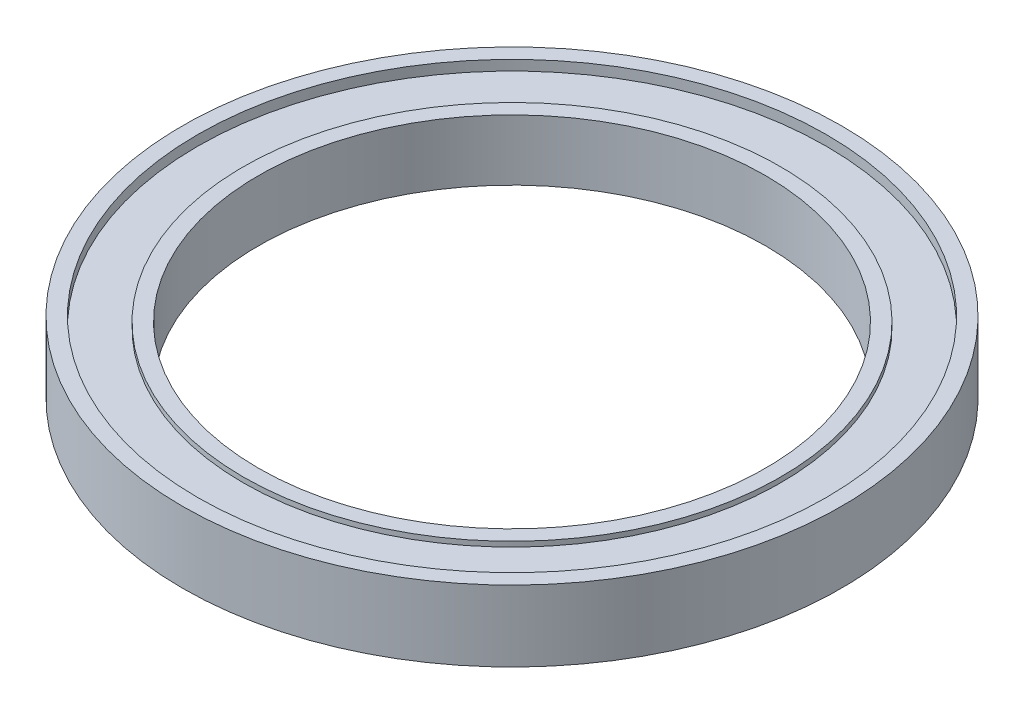
ISO-10303-21;
HEADER;
FILE_DESCRIPTION(('STEP AP214'),'2;1');
FILE_NAME('part.step','',(''),(''),'','','');
FILE_SCHEMA(('AUTOMOTIVE_DESIGN { 1 0 10303 214 1 1 1 1 }'));
ENDSEC;
DATA;
#1=APPLICATION_CONTEXT('core data for automotive mechanical design processes');
#2=APPLICATION_PROTOCOL_DEFINITION('international standard','automotive_design',2000,#1);
#3=PRODUCT_CONTEXT('',#1,'mechanical');
#4=PRODUCT('Part','Part','',(#3));
#5=PRODUCT_RELATED_PRODUCT_CATEGORY('part','',(#4));
#6=PRODUCT_DEFINITION_FORMATION('','',#4);
#7=PRODUCT_DEFINITION_CONTEXT('part definition',#1,'design');
#8=PRODUCT_DEFINITION('design','',#6,#7);
#9=PRODUCT_DEFINITION_SHAPE('','',#8);
#10=(LENGTH_UNIT() NAMED_UNIT(*) SI_UNIT(.MILLI.,.METRE.));
#11=(NAMED_UNIT(*) PLANE_ANGLE_UNIT() SI_UNIT($,.RADIAN.));
#12=(NAMED_UNIT(*) SI_UNIT($,.STERADIAN.) SOLID_ANGLE_UNIT());
#13=UNCERTAINTY_MEASURE_WITH_UNIT(LENGTH_MEASURE(1.E-05),#10,'distance_accuracy_value','');
#14=(GEOMETRIC_REPRESENTATION_CONTEXT(3) GLOBAL_UNCERTAINTY_ASSIGNED_CONTEXT((#13)) GLOBAL_UNIT_ASSIGNED_CONTEXT((#10,
#11,#12)) REPRESENTATION_CONTEXT('',''));
#15=CARTESIAN_POINT('',(0.,0.,0.));
#16=DIRECTION('',(0.,0.,1.));
#17=DIRECTION('',(1.,0.,0.));
#18=AXIS2_PLACEMENT_3D('',#15,#16,#17);
#19=CARTESIAN_POINT('',(0.,7.,0.));
#20=DIRECTION('',(0.,-1.,0.));
#21=DIRECTION('',(0.,0.,-1.));
#22=AXIS2_PLACEMENT_3D('',#19,#20,#21);
#23=CYLINDRICAL_SURFACE('',#22,25.);
#24=CARTESIAN_POINT('',(0.,6.5,0.));
#25=DIRECTION('',(0.,1.,0.));
#26=DIRECTION('',(0.,0.,1.));
#27=AXIS2_PLACEMENT_3D('',#24,#25,#26);
#28=CIRCLE('',#27,25.);
#29=CARTESIAN_POINT('',(0.,6.5,25.));
#30=VERTEX_POINT('',#29);
#31=EDGE_CURVE('E56',#30,#30,#28,.T.);
#32=ORIENTED_EDGE('',*,*,#31,.T.);
#33=EDGE_LOOP('',(#32));
#34=FACE_BOUND('',#33,.T.);
#35=CARTESIAN_POINT('',(0.,0.5,0.));
#36=DIRECTION('',(0.,1.,0.));
#37=DIRECTION('',(0.,0.,1.));
#38=AXIS2_PLACEMENT_3D('',#35,#36,#37);
#39=CIRCLE('',#38,25.);
#40=CARTESIAN_POINT('',(0.,0.5,25.));
#41=VERTEX_POINT('',#40);
#42=EDGE_CURVE('E71',#41,#41,#39,.T.);
#43=ORIENTED_EDGE('',*,*,#42,.F.);
#44=EDGE_LOOP('',(#43));
#45=FACE_BOUND('',#44,.T.);
#46=ADVANCED_FACE('F32',(#34,#45),#23,.F.);
#47=CARTESIAN_POINT('',(0.,1.,0.));
#48=DIRECTION('',(0.,-1.,0.));
#49=DIRECTION('',(0.,0.,-1.));
#50=AXIS2_PLACEMENT_3D('',#47,#48,#49);
#51=CYLINDRICAL_SURFACE('',#50,26.5);
#52=CARTESIAN_POINT('',(0.,1.,0.));
#53=DIRECTION('',(0.,1.,0.));
#54=DIRECTION('',(0.,0.,1.));
#55=AXIS2_PLACEMENT_3D('',#52,#53,#54);
#56=CIRCLE('',#55,26.5);
#57=CARTESIAN_POINT('',(0.,1.,26.5));
#58=VERTEX_POINT('',#57);
#59=EDGE_CURVE('E63',#58,#58,#56,.T.);
#60=ORIENTED_EDGE('',*,*,#59,.F.);
#61=EDGE_LOOP('',(#60));
#62=FACE_BOUND('',#61,.T.);
#63=CARTESIAN_POINT('',(0.,0.5,0.));
#64=DIRECTION('',(0.,1.,0.));
#65=DIRECTION('',(0.,0.,1.));
#66=AXIS2_PLACEMENT_3D('',#63,#64,#65);
#67=CIRCLE('',#66,26.5);
#68=CARTESIAN_POINT('',(0.,0.5,26.5));
#69=VERTEX_POINT('',#68);
#70=EDGE_CURVE('E68',#69,#69,#67,.T.);
#71=ORIENTED_EDGE('',*,*,#70,.T.);
#72=EDGE_LOOP('',(#71));
#73=FACE_BOUND('',#72,.T.);
#74=ADVANCED_FACE('F78',(#62,#73),#51,.T.);
#75=CARTESIAN_POINT('',(0.,6.,0.));
#76=DIRECTION('',(0.,1.,0.));
#77=DIRECTION('',(0.,0.,1.));
#78=AXIS2_PLACEMENT_3D('',#75,#76,#77);
#79=CYLINDRICAL_SURFACE('',#78,26.5);
#80=CARTESIAN_POINT('',(0.,6.,0.));
#81=DIRECTION('',(0.,1.,0.));
#82=DIRECTION('',(0.,0.,1.));
#83=AXIS2_PLACEMENT_3D('',#80,#81,#82);
#84=CIRCLE('',#83,26.5);
#85=CARTESIAN_POINT('',(0.,6.,26.5));
#86=VERTEX_POINT('',#85);
#87=EDGE_CURVE('E48',#86,#86,#84,.T.);
#88=ORIENTED_EDGE('',*,*,#87,.T.);
#89=EDGE_LOOP('',(#88));
#90=FACE_BOUND('',#89,.T.);
#91=CARTESIAN_POINT('',(0.,6.5,0.));
#92=DIRECTION('',(0.,1.,0.));
#93=DIRECTION('',(0.,0.,1.));
#94=AXIS2_PLACEMENT_3D('',#91,#92,#93);
#95=CIRCLE('',#94,26.5);
#96=CARTESIAN_POINT('',(0.,6.5,26.5));
#97=VERTEX_POINT('',#96);
#98=EDGE_CURVE('E53',#97,#97,#95,.T.);
#99=ORIENTED_EDGE('',*,*,#98,.F.);
#100=EDGE_LOOP('',(#99));
#101=FACE_BOUND('',#100,.T.);
#102=ADVANCED_FACE('F84',(#90,#101),#79,.T.);
#103=CARTESIAN_POINT('',(0.,7.,0.));
#104=DIRECTION('',(0.,1.,0.));
#105=DIRECTION('',(0.,0.,1.));
#106=AXIS2_PLACEMENT_3D('',#103,#104,#105);
#107=PLANE('',#106);
#108=CARTESIAN_POINT('',(0.,7.,0.));
#109=DIRECTION('',(0.,1.,0.));
#110=DIRECTION('',(0.,0.,1.));
#111=AXIS2_PLACEMENT_3D('',#108,#109,#110);
#112=CIRCLE('',#111,31.);
#113=CARTESIAN_POINT('',(0.,7.,31.));
#114=VERTEX_POINT('',#113);
#115=EDGE_CURVE('E45',#114,#114,#112,.T.);
#116=ORIENTED_EDGE('',*,*,#115,.F.);
#117=EDGE_LOOP('',(#116));
#118=FACE_BOUND('',#117,.T.);
#119=CARTESIAN_POINT('',(0.,7.,0.));
#120=DIRECTION('',(0.,1.,0.));
#121=DIRECTION('',(0.,0.,1.));
#122=AXIS2_PLACEMENT_3D('',#119,#120,#121);
#123=CIRCLE('',#122,32.5);
#124=CARTESIAN_POINT('',(0.,7.,32.5));
#125=VERTEX_POINT('',#124);
#126=EDGE_CURVE('E10',#125,#125,#123,.T.);
#127=ORIENTED_EDGE('',*,*,#126,.T.);
#128=EDGE_LOOP('',(#127));
#129=FACE_BOUND('',#128,.T.);
#130=ADVANCED_FACE('F91',(#118,#129),#107,.T.);
#131=CARTESIAN_POINT('',(0.,0.,0.));
#132=DIRECTION('',(0.,1.,0.));
#133=DIRECTION('',(0.,0.,1.));
#134=AXIS2_PLACEMENT_3D('',#131,#132,#133);
#135=PLANE('',#134);
#136=CARTESIAN_POINT('',(0.,0.,0.));
#137=DIRECTION('',(0.,1.,0.));
#138=DIRECTION('',(0.,0.,1.));
#139=AXIS2_PLACEMENT_3D('',#136,#137,#138);
#140=CIRCLE('',#139,31.);
#141=CARTESIAN_POINT('',(0.,0.,31.));
#142=VERTEX_POINT('',#141);
#143=EDGE_CURVE('E60',#142,#142,#140,.T.);
#144=ORIENTED_EDGE('',*,*,#143,.T.);
#145=EDGE_LOOP('',(#144));
#146=FACE_BOUND('',#145,.T.);
#147=CARTESIAN_POINT('',(0.,0.,0.));
#148=DIRECTION('',(0.,1.,0.));
#149=DIRECTION('',(0.,0.,1.));
#150=AXIS2_PLACEMENT_3D('',#147,#148,#149);
#151=CIRCLE('',#150,32.5);
#152=CARTESIAN_POINT('',(0.,0.,32.5));
#153=VERTEX_POINT('',#152);
#154=EDGE_CURVE('E36',#153,#153,#151,.T.);
#155=ORIENTED_EDGE('',*,*,#154,.F.);
#156=EDGE_LOOP('',(#155));
#157=FACE_BOUND('',#156,.T.);
#158=ADVANCED_FACE('F93',(#146,#157),#135,.F.);
#159=CARTESIAN_POINT('',(0.,7.,0.));
#160=DIRECTION('',(0.,-1.,0.));
#161=DIRECTION('',(0.,0.,-1.));
#162=AXIS2_PLACEMENT_3D('',#159,#160,#161);
#163=CYLINDRICAL_SURFACE('',#162,32.5);
#164=ORIENTED_EDGE('',*,*,#126,.F.);
#165=EDGE_LOOP('',(#164));
#166=FACE_BOUND('',#165,.T.);
#167=ORIENTED_EDGE('',*,*,#154,.T.);
#168=EDGE_LOOP('',(#167));
#169=FACE_BOUND('',#168,.T.);
#170=ADVANCED_FACE('F34',(#166,#169),#163,.T.);
#171=CARTESIAN_POINT('',(0.,6.,0.));
#172=DIRECTION('',(0.,1.,0.));
#173=DIRECTION('',(0.,0.,1.));
#174=AXIS2_PLACEMENT_3D('',#171,#172,#173);
#175=CYLINDRICAL_SURFACE('',#174,31.);
#176=CARTESIAN_POINT('',(0.,6.,0.));
#177=DIRECTION('',(0.,1.,0.));
#178=DIRECTION('',(0.,0.,1.));
#179=AXIS2_PLACEMENT_3D('',#176,#177,#178);
#180=CIRCLE('',#179,31.);
#181=CARTESIAN_POINT('',(0.,6.,31.));
#182=VERTEX_POINT('',#181);
#183=EDGE_CURVE('E43',#182,#182,#180,.T.);
#184=ORIENTED_EDGE('',*,*,#183,.F.);
#185=EDGE_LOOP('',(#184));
#186=FACE_BOUND('',#185,.T.);
#187=ORIENTED_EDGE('',*,*,#115,.T.);
#188=EDGE_LOOP('',(#187));
#189=FACE_BOUND('',#188,.T.);
#190=ADVANCED_FACE('F89',(#186,#189),#175,.F.);
#191=CARTESIAN_POINT('',(0.,6.,0.));
#192=DIRECTION('',(0.,1.,0.));
#193=DIRECTION('',(0.,0.,1.));
#194=AXIS2_PLACEMENT_3D('',#191,#192,#193);
#195=PLANE('',#194);
#196=ORIENTED_EDGE('',*,*,#87,.F.);
#197=EDGE_LOOP('',(#196));
#198=FACE_BOUND('',#197,.T.);
#199=ORIENTED_EDGE('',*,*,#183,.T.);
#200=EDGE_LOOP('',(#199));
#201=FACE_BOUND('',#200,.T.);
#202=ADVANCED_FACE('F123',(#198,#201),#195,.T.);
#203=CARTESIAN_POINT('',(0.,6.5,0.));
#204=DIRECTION('',(0.,1.,0.));
#205=DIRECTION('',(0.,0.,1.));
#206=AXIS2_PLACEMENT_3D('',#203,#204,#205);
#207=PLANE('',#206);
#208=ORIENTED_EDGE('',*,*,#31,.F.);
#209=EDGE_LOOP('',(#208));
#210=FACE_BOUND('',#209,.T.);
#211=ORIENTED_EDGE('',*,*,#98,.T.);
#212=EDGE_LOOP('',(#211));
#213=FACE_BOUND('',#212,.T.);
#214=ADVANCED_FACE('F117',(#210,#213),#207,.T.);
#215=CARTESIAN_POINT('',(0.,1.,0.));
#216=DIRECTION('',(0.,-1.,0.));
#217=DIRECTION('',(0.,0.,1.));
#218=AXIS2_PLACEMENT_3D('',#215,#216,#217);
#219=PLANE('',#218);
#220=CARTESIAN_POINT('',(0.,1.,0.));
#221=DIRECTION('',(0.,1.,0.));
#222=DIRECTION('',(0.,0.,1.));
#223=AXIS2_PLACEMENT_3D('',#220,#221,#222);
#224=CIRCLE('',#223,31.);
#225=CARTESIAN_POINT('',(0.,1.,31.));
#226=VERTEX_POINT('',#225);
#227=EDGE_CURVE('E59',#226,#226,#224,.T.);
#228=ORIENTED_EDGE('',*,*,#227,.F.);
#229=EDGE_LOOP('',(#228));
#230=FACE_BOUND('',#229,.T.);
#231=ORIENTED_EDGE('',*,*,#59,.T.);
#232=EDGE_LOOP('',(#231));
#233=FACE_BOUND('',#232,.T.);
#234=ADVANCED_FACE('F108',(#230,#233),#219,.T.);
#235=CARTESIAN_POINT('',(0.,1.,0.));
#236=DIRECTION('',(0.,-1.,0.));
#237=DIRECTION('',(0.,0.,-1.));
#238=AXIS2_PLACEMENT_3D('',#235,#236,#237);
#239=CYLINDRICAL_SURFACE('',#238,31.);
#240=ORIENTED_EDGE('',*,*,#227,.T.);
#241=EDGE_LOOP('',(#240));
#242=FACE_BOUND('',#241,.T.);
#243=ORIENTED_EDGE('',*,*,#143,.F.);
#244=EDGE_LOOP('',(#243));
#245=FACE_BOUND('',#244,.T.);
#246=ADVANCED_FACE('F106',(#242,#245),#239,.F.);
#247=CARTESIAN_POINT('',(0.,0.5,0.));
#248=DIRECTION('',(0.,-1.,0.));
#249=DIRECTION('',(0.,0.,1.));
#250=AXIS2_PLACEMENT_3D('',#247,#248,#249);
#251=PLANE('',#250);
#252=ORIENTED_EDGE('',*,*,#70,.F.);
#253=EDGE_LOOP('',(#252));
#254=FACE_BOUND('',#253,.T.);
#255=ORIENTED_EDGE('',*,*,#42,.T.);
#256=EDGE_LOOP('',(#255));
#257=FACE_BOUND('',#256,.T.);
#258=ADVANCED_FACE('F75',(#254,#257),#251,.T.);
#259=CLOSED_SHELL('',(#46,#74,#102,#130,#158,#170,#190,#202,#214,#234,#246,#258));
#260=MANIFOLD_SOLID_BREP('B2',#259);
#261=ADVANCED_BREP_SHAPE_REPRESENTATION('',(#18,#260),#14);
#262=SHAPE_DEFINITION_REPRESENTATION(#9,#261);
ENDSEC;
END-ISO-10303-21;
